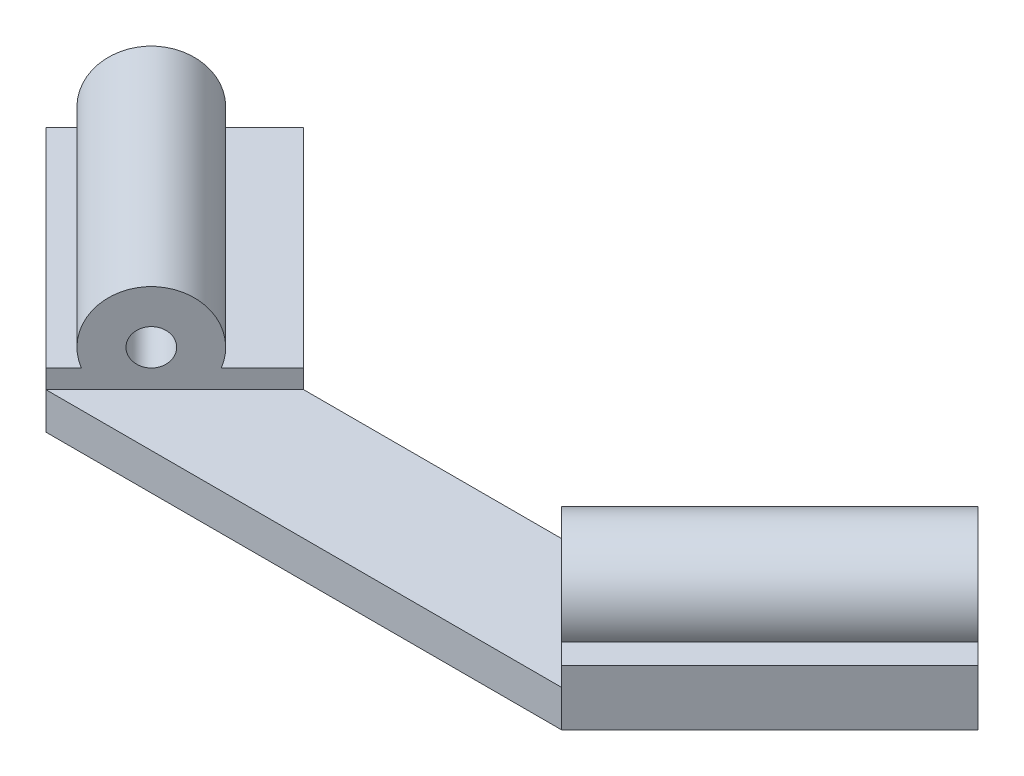
ISO-10303-21;
HEADER;
FILE_DESCRIPTION(('STEP AP214'),'2;1');
FILE_NAME('part.step','',(''),(''),'','','');
FILE_SCHEMA(('AUTOMOTIVE_DESIGN { 1 0 10303 214 1 1 1 1 }'));
ENDSEC;
DATA;
#1=APPLICATION_CONTEXT('core data for automotive mechanical design processes');
#2=APPLICATION_PROTOCOL_DEFINITION('international standard','automotive_design',2000,#1);
#3=PRODUCT_CONTEXT('',#1,'mechanical');
#4=PRODUCT('Part','Part','',(#3));
#5=PRODUCT_RELATED_PRODUCT_CATEGORY('part','',(#4));
#6=PRODUCT_DEFINITION_FORMATION('','',#4);
#7=PRODUCT_DEFINITION_CONTEXT('part definition',#1,'design');
#8=PRODUCT_DEFINITION('design','',#6,#7);
#9=PRODUCT_DEFINITION_SHAPE('','',#8);
#10=(LENGTH_UNIT() NAMED_UNIT(*) SI_UNIT(.MILLI.,.METRE.));
#11=(NAMED_UNIT(*) PLANE_ANGLE_UNIT() SI_UNIT($,.RADIAN.));
#12=(NAMED_UNIT(*) SI_UNIT($,.STERADIAN.) SOLID_ANGLE_UNIT());
#13=UNCERTAINTY_MEASURE_WITH_UNIT(LENGTH_MEASURE(1.E-05),#10,'distance_accuracy_value','');
#14=(GEOMETRIC_REPRESENTATION_CONTEXT(3) GLOBAL_UNCERTAINTY_ASSIGNED_CONTEXT((#13)) GLOBAL_UNIT_ASSIGNED_CONTEXT((#10,
#11,#12)) REPRESENTATION_CONTEXT('',''));
#15=CARTESIAN_POINT('',(0.,0.,0.));
#16=DIRECTION('',(0.,0.,1.));
#17=DIRECTION('',(1.,0.,0.));
#18=AXIS2_PLACEMENT_3D('',#15,#16,#17);
#19=CARTESIAN_POINT('',(-96.8356396317676,9.,19.6760971124126));
#20=DIRECTION('',(0.,0.,1.));
#21=DIRECTION('',(1.,0.,0.));
#22=AXIS2_PLACEMENT_3D('',#19,#20,#21);
#23=PLANE('',#22);
#24=DIRECTION('',(-1.,0.,0.));
#25=VECTOR('',#24,1.);
#26=CARTESIAN_POINT('',(-96.8356396317676,4.,19.6760971124126));
#27=LINE('',#26,#25);
#28=CARTESIAN_POINT('',(-61.8356396317676,4.,19.6760971124126));
#29=VERTEX_POINT('',#28);
#30=CARTESIAN_POINT('',(-96.8356396317677,4.,19.6760971124125));
#31=VERTEX_POINT('',#30);
#32=EDGE_CURVE('E279',#29,#31,#27,.T.);
#33=ORIENTED_EDGE('',*,*,#32,.T.);
#34=DIRECTION('',(0.,-1.,0.));
#35=VECTOR('',#34,1.);
#36=CARTESIAN_POINT('',(-96.8356396317676,9.,19.6760971124126));
#37=LINE('',#36,#35);
#38=CARTESIAN_POINT('',(-96.8356396317677,9.,19.6760971124125));
#39=VERTEX_POINT('',#38);
#40=EDGE_CURVE('E49',#39,#31,#37,.T.);
#41=ORIENTED_EDGE('',*,*,#40,.F.);
#42=DIRECTION('',(-1.,0.,0.));
#43=VECTOR('',#42,1.);
#44=CARTESIAN_POINT('',(-96.8356396317676,9.,19.6760971124126));
#45=LINE('',#44,#43);
#46=CARTESIAN_POINT('',(-61.8356396317676,9.,19.6760971124126));
#47=VERTEX_POINT('',#46);
#48=EDGE_CURVE('E284',#47,#39,#45,.T.);
#49=ORIENTED_EDGE('',*,*,#48,.F.);
#50=DIRECTION('',(0.,-1.,0.));
#51=VECTOR('',#50,1.);
#52=CARTESIAN_POINT('',(-61.8356396317676,9.,19.6760971124126));
#53=LINE('',#52,#51);
#54=EDGE_CURVE('E11',#47,#29,#53,.T.);
#55=ORIENTED_EDGE('',*,*,#54,.T.);
#56=EDGE_LOOP('',(#33,#41,#49,#55));
#57=FACE_BOUND('',#56,.T.);
#58=ADVANCED_FACE('F41',(#57),#23,.F.);
#59=CARTESIAN_POINT('',(-114.335639631768,9.,37.1760971124125));
#60=DIRECTION('',(0.,0.,-1.));
#61=DIRECTION('',(-1.,0.,0.));
#62=AXIS2_PLACEMENT_3D('',#59,#60,#61);
#63=PLANE('',#62);
#64=DIRECTION('',(1.,0.,0.));
#65=VECTOR('',#64,1.);
#66=CARTESIAN_POINT('',(-114.335639631768,4.,37.1760971124125));
#67=LINE('',#66,#65);
#68=CARTESIAN_POINT('',(-114.335639631768,4.,37.1760971124125));
#69=VERTEX_POINT('',#68);
#70=CARTESIAN_POINT('',(-44.3356396317675,4.,37.1760971124125));
#71=VERTEX_POINT('',#70);
#72=EDGE_CURVE('E285',#69,#71,#67,.T.);
#73=ORIENTED_EDGE('',*,*,#72,.T.);
#74=DIRECTION('',(0.,-1.,0.));
#75=VECTOR('',#74,1.);
#76=CARTESIAN_POINT('',(-44.3356396317675,9.,37.1760971124125));
#77=LINE('',#76,#75);
#78=CARTESIAN_POINT('',(-44.3356396317675,9.,37.1760971124125));
#79=VERTEX_POINT('',#78);
#80=EDGE_CURVE('E297',#79,#71,#77,.T.);
#81=ORIENTED_EDGE('',*,*,#80,.F.);
#82=DIRECTION('',(1.,0.,0.));
#83=VECTOR('',#82,1.);
#84=CARTESIAN_POINT('',(-114.335639631768,9.,37.1760971124125));
#85=LINE('',#84,#83);
#86=CARTESIAN_POINT('',(-114.335639631768,9.,37.1760971124125));
#87=VERTEX_POINT('',#86);
#88=EDGE_CURVE('E293',#87,#79,#85,.T.);
#89=ORIENTED_EDGE('',*,*,#88,.F.);
#90=DIRECTION('',(0.,-1.,0.));
#91=VECTOR('',#90,1.);
#92=CARTESIAN_POINT('',(-114.335639631768,9.,37.1760971124125));
#93=LINE('',#92,#91);
#94=EDGE_CURVE('E56',#87,#69,#93,.T.);
#95=ORIENTED_EDGE('',*,*,#94,.T.);
#96=EDGE_LOOP('',(#73,#81,#89,#95));
#97=FACE_BOUND('',#96,.T.);
#98=ADVANCED_FACE('F339',(#97),#63,.F.);
#99=CARTESIAN_POINT('',(0.,9.,0.));
#100=DIRECTION('',(0.,-1.,0.));
#101=DIRECTION('',(0.,0.,-1.));
#102=AXIS2_PLACEMENT_3D('',#99,#100,#101);
#103=PLANE('',#102);
#104=DIRECTION('',(-0.707106781186551,0.,-0.707106781186544));
#105=VECTOR('',#104,1.);
#106=CARTESIAN_POINT('',(-44.3356396317675,9.,37.1760971124125));
#107=LINE('',#106,#105);
#108=EDGE_CURVE('E280',#79,#47,#107,.T.);
#109=ORIENTED_EDGE('',*,*,#108,.T.);
#110=ORIENTED_EDGE('',*,*,#48,.T.);
#111=DIRECTION('',(-0.707106781186546,0.,0.707106781186549));
#112=VECTOR('',#111,1.);
#113=CARTESIAN_POINT('',(-114.335639631768,9.,37.1760971124125));
#114=LINE('',#113,#112);
#115=EDGE_CURVE('E289',#39,#87,#114,.T.);
#116=ORIENTED_EDGE('',*,*,#115,.T.);
#117=ORIENTED_EDGE('',*,*,#88,.T.);
#118=EDGE_LOOP('',(#109,#110,#116,#117));
#119=FACE_BOUND('',#118,.T.);
#120=ADVANCED_FACE('F321',(#119),#103,.F.);
#121=CARTESIAN_POINT('',(0.,4.,0.));
#122=DIRECTION('',(0.,-1.,0.));
#123=DIRECTION('',(0.,0.,-1.));
#124=AXIS2_PLACEMENT_3D('',#121,#122,#123);
#125=PLANE('',#124);
#126=ORIENTED_EDGE('',*,*,#32,.F.);
#127=DIRECTION('',(-0.707106781186544,0.,0.707106781186551));
#128=VECTOR('',#127,1.);
#129=CARTESIAN_POINT('',(-33.5513683843059,4.,-8.60817413504949));
#130=LINE('',#129,#128);
#131=CARTESIAN_POINT('',(-33.5513683843059,4.,-8.60817413504949));
#132=VERTEX_POINT('',#131);
#133=EDGE_CURVE('E273',#132,#29,#130,.T.);
#134=ORIENTED_EDGE('',*,*,#133,.F.);
#135=DIRECTION('',(-0.707106781186551,0.,-0.707106781186544));
#136=VECTOR('',#135,1.);
#137=CARTESIAN_POINT('',(-12.471597124628,4.,12.4715971246282));
#138=LINE('',#137,#136);
#139=CARTESIAN_POINT('',(-16.0513683843058,4.,8.89182586495045));
#140=VERTEX_POINT('',#139);
#141=EDGE_CURVE('E227',#140,#132,#138,.T.);
#142=ORIENTED_EDGE('',*,*,#141,.F.);
#143=DIRECTION('',(-0.707106781186544,0.,0.707106781186551));
#144=VECTOR('',#143,1.);
#145=CARTESIAN_POINT('',(-16.0513683843058,4.,8.89182586495045));
#146=LINE('',#145,#144);
#147=EDGE_CURVE('E276',#140,#71,#146,.T.);
#148=ORIENTED_EDGE('',*,*,#147,.T.);
#149=ORIENTED_EDGE('',*,*,#72,.F.);
#150=DIRECTION('',(0.707106781186549,0.,0.707106781186546));
#151=VECTOR('',#150,1.);
#152=CARTESIAN_POINT('',(-142.61991087923,4.,8.89182586495062));
#153=LINE('',#152,#151);
#154=CARTESIAN_POINT('',(-142.61991087923,4.,8.89182586495062));
#155=VERTEX_POINT('',#154);
#156=EDGE_CURVE('E154',#155,#69,#153,.T.);
#157=ORIENTED_EDGE('',*,*,#156,.F.);
#158=DIRECTION('',(-0.707106781186546,0.,0.707106781186549));
#159=VECTOR('',#158,1.);
#160=CARTESIAN_POINT('',(-66.8640425071397,4.,-66.8640425071395));
#161=LINE('',#160,#159);
#162=CARTESIAN_POINT('',(-125.11991087923,4.,-8.60817413504933));
#163=VERTEX_POINT('',#162);
#164=EDGE_CURVE('E158',#163,#155,#161,.T.);
#165=ORIENTED_EDGE('',*,*,#164,.F.);
#166=DIRECTION('',(0.707106781186549,0.,0.707106781186546));
#167=VECTOR('',#166,1.);
#168=CARTESIAN_POINT('',(-125.11991087923,4.,-8.60817413504933));
#169=LINE('',#168,#167);
#170=EDGE_CURVE('E140',#163,#31,#169,.T.);
#171=ORIENTED_EDGE('',*,*,#170,.T.);
#172=EDGE_LOOP('',(#126,#134,#142,#148,#149,#157,#165,#171));
#173=FACE_BOUND('',#172,.T.);
#174=ADVANCED_FACE('F159',(#173),#125,.T.);
#175=CARTESIAN_POINT('',(-16.0513683843058,0.,8.89182586495046));
#176=DIRECTION('',(0.707106781186551,0.,0.707106781186544));
#177=DIRECTION('',(0.707106781186544,0.,-0.707106781186551));
#178=AXIS2_PLACEMENT_3D('',#175,#176,#177);
#179=PLANE('',#178);
#180=ORIENTED_EDGE('',*,*,#80,.T.);
#181=ORIENTED_EDGE('',*,*,#147,.F.);
#182=DIRECTION('',(0.,1.,0.));
#183=VECTOR('',#182,1.);
#184=CARTESIAN_POINT('',(-16.0513683843058,0.,8.89182586495046));
#185=LINE('',#184,#183);
#186=CARTESIAN_POINT('',(-16.0513683843058,11.55,8.89182586495046));
#187=VERTEX_POINT('',#186);
#188=EDGE_CURVE('E222',#140,#187,#185,.T.);
#189=ORIENTED_EDGE('',*,*,#188,.T.);
#190=DIRECTION('',(-0.707106781186544,0.,0.707106781186551));
#191=VECTOR('',#190,1.);
#192=CARTESIAN_POINT('',(-16.0513683843058,11.55,8.89182586495046));
#193=LINE('',#192,#191);
#194=CARTESIAN_POINT('',(-44.3356396317675,11.55,37.1760971124125));
#195=VERTEX_POINT('',#194);
#196=EDGE_CURVE('E259',#187,#195,#193,.T.);
#197=ORIENTED_EDGE('',*,*,#196,.T.);
#198=DIRECTION('',(0.,1.,0.));
#199=VECTOR('',#198,1.);
#200=CARTESIAN_POINT('',(-44.3356396317675,0.,37.1760971124125));
#201=LINE('',#200,#199);
#202=EDGE_CURVE('E245',#79,#195,#201,.T.);
#203=ORIENTED_EDGE('',*,*,#202,.F.);
#204=EDGE_LOOP('',(#180,#181,#189,#197,#203));
#205=FACE_BOUND('',#204,.T.);
#206=ADVANCED_FACE('F334',(#205),#179,.T.);
#207=CARTESIAN_POINT('',(-33.5513683843059,0.,-8.60817413504948));
#208=DIRECTION('',(0.707106781186551,0.,0.707106781186544));
#209=DIRECTION('',(0.707106781186544,0.,-0.707106781186551));
#210=AXIS2_PLACEMENT_3D('',#207,#208,#209);
#211=PLANE('',#210);
#212=ORIENTED_EDGE('',*,*,#54,.F.);
#213=DIRECTION('',(0.,1.,0.));
#214=VECTOR('',#213,1.);
#215=CARTESIAN_POINT('',(-61.8356396317676,0.,19.6760971124126));
#216=LINE('',#215,#214);
#217=CARTESIAN_POINT('',(-61.8356396317676,11.55,19.6760971124126));
#218=VERTEX_POINT('',#217);
#219=EDGE_CURVE('E248',#47,#218,#216,.T.);
#220=ORIENTED_EDGE('',*,*,#219,.T.);
#221=DIRECTION('',(-0.707106781186544,0.,0.707106781186551));
#222=VECTOR('',#221,1.);
#223=CARTESIAN_POINT('',(-33.5513683843059,11.55,-8.60817413504949));
#224=LINE('',#223,#222);
#225=CARTESIAN_POINT('',(-33.5513683843059,11.55,-8.60817413504949));
#226=VERTEX_POINT('',#225);
#227=EDGE_CURVE('E269',#226,#218,#224,.T.);
#228=ORIENTED_EDGE('',*,*,#227,.F.);
#229=DIRECTION('',(0.,1.,0.));
#230=VECTOR('',#229,1.);
#231=CARTESIAN_POINT('',(-33.5513683843059,0.,-8.60817413504948));
#232=LINE('',#231,#230);
#233=EDGE_CURVE('E231',#132,#226,#232,.T.);
#234=ORIENTED_EDGE('',*,*,#233,.F.);
#235=ORIENTED_EDGE('',*,*,#133,.T.);
#236=EDGE_LOOP('',(#212,#220,#228,#234,#235));
#237=FACE_BOUND('',#236,.T.);
#238=ADVANCED_FACE('F327',(#237),#211,.F.);
#239=CARTESIAN_POINT('',(-12.471597124628,11.55,12.4715971246282));
#240=DIRECTION('',(0.,1.,0.));
#241=DIRECTION('',(0.,0.,1.));
#242=AXIS2_PLACEMENT_3D('',#239,#240,#241);
#243=PLANE('',#242);
#244=DIRECTION('',(-0.707106781186551,0.,-0.707106781186544));
#245=VECTOR('',#244,1.);
#246=CARTESIAN_POINT('',(-40.7558683720898,11.55,40.7558683720902));
#247=LINE('',#246,#245);
#248=CARTESIAN_POINT('',(-56.6114132583052,11.55,24.9003234858749));
#249=VERTEX_POINT('',#248);
#250=EDGE_CURVE('E251',#249,#218,#247,.T.);
#251=ORIENTED_EDGE('',*,*,#250,.F.);
#252=DIRECTION('',(-0.707106781186544,0.,0.707106781186551));
#253=VECTOR('',#252,1.);
#254=CARTESIAN_POINT('',(-28.3271420108435,11.55,-3.38394776158714));
#255=LINE('',#254,#253);
#256=CARTESIAN_POINT('',(-28.3271420108435,11.55,-3.38394776158714));
#257=VERTEX_POINT('',#256);
#258=EDGE_CURVE('E266',#257,#249,#255,.T.);
#259=ORIENTED_EDGE('',*,*,#258,.F.);
#260=DIRECTION('',(-0.707106781186551,0.,-0.707106781186544));
#261=VECTOR('',#260,1.);
#262=CARTESIAN_POINT('',(-12.471597124628,11.55,12.4715971246282));
#263=LINE('',#262,#261);
#264=EDGE_CURVE('E234',#257,#226,#263,.T.);
#265=ORIENTED_EDGE('',*,*,#264,.T.);
#266=ORIENTED_EDGE('',*,*,#227,.T.);
#267=EDGE_LOOP('',(#251,#259,#265,#266));
#268=FACE_BOUND('',#267,.T.);
#269=ADVANCED_FACE('F359',(#268),#243,.T.);
#270=CARTESIAN_POINT('',(-23.5785711732125,13.9862500000003,1.36462307604383));
#271=DIRECTION('',(-0.707106781186544,0.,0.707106781186551));
#272=DIRECTION('',(0.707106781186551,0.,0.707106781186544));
#273=AXIS2_PLACEMENT_3D('',#270,#271,#272);
#274=CYLINDRICAL_SURFACE('',#273,7.14375);
#275=CARTESIAN_POINT('',(-51.8628424206742,13.9862500000003,29.6488943235059));
#276=DIRECTION('',(0.707106781186544,0.,-0.707106781186551));
#277=DIRECTION('',(-0.707106781186551,0.,-0.707106781186544));
#278=AXIS2_PLACEMENT_3D('',#275,#276,#277);
#279=CIRCLE('',#278,7.14375);
#280=CARTESIAN_POINT('',(-47.1142715830432,11.55,34.3974651611368));
#281=VERTEX_POINT('',#280);
#282=EDGE_CURVE('E255',#249,#281,#279,.T.);
#283=ORIENTED_EDGE('',*,*,#282,.T.);
#284=DIRECTION('',(-0.707106781186544,0.,0.707106781186551));
#285=VECTOR('',#284,1.);
#286=CARTESIAN_POINT('',(-18.8300003355815,11.55,6.11319391367479));
#287=LINE('',#286,#285);
#288=CARTESIAN_POINT('',(-18.8300003355815,11.55,6.11319391367479));
#289=VERTEX_POINT('',#288);
#290=EDGE_CURVE('E263',#289,#281,#287,.T.);
#291=ORIENTED_EDGE('',*,*,#290,.F.);
#292=CARTESIAN_POINT('',(-23.5785711732125,13.9862500000003,1.36462307604383));
#293=DIRECTION('',(0.707106781186544,0.,-0.707106781186551));
#294=DIRECTION('',(-0.707106781186551,0.,-0.707106781186544));
#295=AXIS2_PLACEMENT_3D('',#292,#293,#294);
#296=CIRCLE('',#295,7.14375);
#297=EDGE_CURVE('E238',#257,#289,#296,.T.);
#298=ORIENTED_EDGE('',*,*,#297,.F.);
#299=ORIENTED_EDGE('',*,*,#258,.T.);
#300=EDGE_LOOP('',(#283,#291,#298,#299));
#301=FACE_BOUND('',#300,.T.);
#302=ADVANCED_FACE('F353',(#301),#274,.T.);
#303=CARTESIAN_POINT('',(-23.5785711732125,13.9862500000003,1.36462307604383));
#304=DIRECTION('',(-0.707106781186544,0.,0.707106781186551));
#305=DIRECTION('',(0.707106781186551,0.,0.707106781186544));
#306=AXIS2_PLACEMENT_3D('',#303,#304,#305);
#307=CYLINDRICAL_SURFACE('',#306,2.43625000000026);
#308=CARTESIAN_POINT('',(-23.5785711732125,13.9862500000003,1.36462307604383));
#309=DIRECTION('',(0.707106781186544,0.,-0.707106781186551));
#310=DIRECTION('',(-0.707106781186551,0.,-0.707106781186544));
#311=AXIS2_PLACEMENT_3D('',#308,#309,#310);
#312=CIRCLE('',#311,2.43625000000026);
#313=CARTESIAN_POINT('',(-25.3012600688784,13.9862500000003,-0.358065819622068));
#314=VERTEX_POINT('',#313);
#315=EDGE_CURVE('E218',#314,#314,#312,.T.);
#316=ORIENTED_EDGE('',*,*,#315,.T.);
#317=EDGE_LOOP('',(#316));
#318=FACE_BOUND('',#317,.T.);
#319=CARTESIAN_POINT('',(-51.8628424206742,13.9862500000003,29.6488943235059));
#320=DIRECTION('',(0.707106781186544,0.,-0.707106781186551));
#321=DIRECTION('',(-0.707106781186551,0.,-0.707106781186544));
#322=AXIS2_PLACEMENT_3D('',#319,#320,#321);
#323=CIRCLE('',#322,2.43625000000026);
#324=CARTESIAN_POINT('',(-53.5855313163401,13.9862500000003,27.92620542784));
#325=VERTEX_POINT('',#324);
#326=EDGE_CURVE('E153',#325,#325,#323,.T.);
#327=ORIENTED_EDGE('',*,*,#326,.F.);
#328=EDGE_LOOP('',(#327));
#329=FACE_BOUND('',#328,.T.);
#330=ADVANCED_FACE('F349',(#318,#329),#307,.F.);
#331=EDGE_CURVE('E223',#195,#281,#247,.T.);
#332=ORIENTED_EDGE('',*,*,#331,.F.);
#333=ORIENTED_EDGE('',*,*,#196,.F.);
#334=EDGE_CURVE('E239',#187,#289,#263,.T.);
#335=ORIENTED_EDGE('',*,*,#334,.T.);
#336=ORIENTED_EDGE('',*,*,#290,.T.);
#337=EDGE_LOOP('',(#332,#333,#335,#336));
#338=FACE_BOUND('',#337,.T.);
#339=ADVANCED_FACE('F352',(#338),#243,.T.);
#340=CARTESIAN_POINT('',(-12.471597124628,0.,12.4715971246282));
#341=DIRECTION('',(0.707106781186544,0.,-0.707106781186551));
#342=DIRECTION('',(-0.707106781186551,0.,-0.707106781186544));
#343=AXIS2_PLACEMENT_3D('',#340,#341,#342);
#344=PLANE('',#343);
#345=ORIENTED_EDGE('',*,*,#315,.F.);
#346=EDGE_LOOP('',(#345));
#347=FACE_BOUND('',#346,.T.);
#348=ORIENTED_EDGE('',*,*,#188,.F.);
#349=ORIENTED_EDGE('',*,*,#141,.T.);
#350=ORIENTED_EDGE('',*,*,#233,.T.);
#351=ORIENTED_EDGE('',*,*,#264,.F.);
#352=ORIENTED_EDGE('',*,*,#297,.T.);
#353=ORIENTED_EDGE('',*,*,#334,.F.);
#354=EDGE_LOOP('',(#348,#349,#350,#351,#352,#353));
#355=FACE_BOUND('',#354,.T.);
#356=ADVANCED_FACE('F331',(#347,#355),#344,.T.);
#357=CARTESIAN_POINT('',(-40.7558683720898,0.,40.7558683720902));
#358=DIRECTION('',(0.707106781186544,0.,-0.707106781186551));
#359=DIRECTION('',(-0.707106781186551,0.,-0.707106781186544));
#360=AXIS2_PLACEMENT_3D('',#357,#358,#359);
#361=PLANE('',#360);
#362=ORIENTED_EDGE('',*,*,#108,.F.);
#363=ORIENTED_EDGE('',*,*,#202,.T.);
#364=ORIENTED_EDGE('',*,*,#331,.T.);
#365=ORIENTED_EDGE('',*,*,#282,.F.);
#366=ORIENTED_EDGE('',*,*,#250,.T.);
#367=ORIENTED_EDGE('',*,*,#219,.F.);
#368=EDGE_LOOP('',(#362,#363,#364,#365,#366,#367));
#369=FACE_BOUND('',#368,.T.);
#370=ORIENTED_EDGE('',*,*,#326,.T.);
#371=EDGE_LOOP('',(#370));
#372=FACE_BOUND('',#371,.T.);
#373=ADVANCED_FACE('F366',(#369,#372),#361,.F.);
#374=CARTESIAN_POINT('',(-125.11991087923,0.,-8.60817413504934));
#375=DIRECTION('',(0.707106781186546,0.,-0.707106781186549));
#376=DIRECTION('',(-0.707106781186549,0.,-0.707106781186546));
#377=AXIS2_PLACEMENT_3D('',#374,#375,#376);
#378=PLANE('',#377);
#379=ORIENTED_EDGE('',*,*,#40,.T.);
#380=ORIENTED_EDGE('',*,*,#170,.F.);
#381=DIRECTION('',(0.,1.,0.));
#382=VECTOR('',#381,1.);
#383=CARTESIAN_POINT('',(-125.11991087923,0.,-8.60817413504934));
#384=LINE('',#383,#382);
#385=CARTESIAN_POINT('',(-125.11991087923,11.55,-8.60817413504934));
#386=VERTEX_POINT('',#385);
#387=EDGE_CURVE('E145',#163,#386,#384,.T.);
#388=ORIENTED_EDGE('',*,*,#387,.T.);
#389=DIRECTION('',(0.707106781186549,0.,0.707106781186546));
#390=VECTOR('',#389,1.);
#391=CARTESIAN_POINT('',(-125.11991087923,11.55,-8.60817413504934));
#392=LINE('',#391,#390);
#393=CARTESIAN_POINT('',(-96.8356396317677,11.55,19.6760971124125));
#394=VERTEX_POINT('',#393);
#395=EDGE_CURVE('E203',#386,#394,#392,.T.);
#396=ORIENTED_EDGE('',*,*,#395,.T.);
#397=DIRECTION('',(0.,1.,0.));
#398=VECTOR('',#397,1.);
#399=CARTESIAN_POINT('',(-96.8356396317677,0.,19.6760971124125));
#400=LINE('',#399,#398);
#401=EDGE_CURVE('E189',#39,#394,#400,.T.);
#402=ORIENTED_EDGE('',*,*,#401,.F.);
#403=EDGE_LOOP('',(#379,#380,#388,#396,#402));
#404=FACE_BOUND('',#403,.T.);
#405=ADVANCED_FACE('F142',(#404),#378,.T.);
#406=CARTESIAN_POINT('',(-142.61991087923,0.,8.8918258649506));
#407=DIRECTION('',(0.707106781186546,0.,-0.707106781186549));
#408=DIRECTION('',(-0.707106781186549,0.,-0.707106781186546));
#409=AXIS2_PLACEMENT_3D('',#406,#407,#408);
#410=PLANE('',#409);
#411=ORIENTED_EDGE('',*,*,#94,.F.);
#412=DIRECTION('',(0.,1.,0.));
#413=VECTOR('',#412,1.);
#414=CARTESIAN_POINT('',(-114.335639631768,0.,37.1760971124124));
#415=LINE('',#414,#413);
#416=CARTESIAN_POINT('',(-114.335639631768,11.55,37.1760971124124));
#417=VERTEX_POINT('',#416);
#418=EDGE_CURVE('E192',#87,#417,#415,.T.);
#419=ORIENTED_EDGE('',*,*,#418,.T.);
#420=DIRECTION('',(0.707106781186549,0.,0.707106781186546));
#421=VECTOR('',#420,1.);
#422=CARTESIAN_POINT('',(-142.61991087923,11.55,8.8918258649506));
#423=LINE('',#422,#421);
#424=CARTESIAN_POINT('',(-142.61991087923,11.55,8.8918258649506));
#425=VERTEX_POINT('',#424);
#426=EDGE_CURVE('E212',#425,#417,#423,.T.);
#427=ORIENTED_EDGE('',*,*,#426,.F.);
#428=DIRECTION('',(0.,1.,0.));
#429=VECTOR('',#428,1.);
#430=CARTESIAN_POINT('',(-142.61991087923,0.,8.8918258649506));
#431=LINE('',#430,#429);
#432=EDGE_CURVE('E163',#155,#425,#431,.T.);
#433=ORIENTED_EDGE('',*,*,#432,.F.);
#434=ORIENTED_EDGE('',*,*,#156,.T.);
#435=EDGE_LOOP('',(#411,#419,#427,#433,#434));
#436=FACE_BOUND('',#435,.T.);
#437=ADVANCED_FACE('F380',(#436),#410,.F.);
#438=CARTESIAN_POINT('',(-66.8640425071397,11.55,-66.8640425071395));
#439=DIRECTION('',(0.,1.,0.));
#440=DIRECTION('',(0.,0.,1.));
#441=AXIS2_PLACEMENT_3D('',#438,#439,#440);
#442=PLANE('',#441);
#443=DIRECTION('',(-0.707106781186546,0.,0.707106781186549));
#444=VECTOR('',#443,1.);
#445=CARTESIAN_POINT('',(-38.5797712596777,11.55,-38.5797712596776));
#446=LINE('',#445,#444);
#447=CARTESIAN_POINT('',(-111.932846059655,11.55,34.7733035402998));
#448=VERTEX_POINT('',#447);
#449=EDGE_CURVE('E195',#448,#417,#446,.T.);
#450=ORIENTED_EDGE('',*,*,#449,.F.);
#451=DIRECTION('',(0.707106781186549,0.,0.707106781186546));
#452=VECTOR('',#451,1.);
#453=CARTESIAN_POINT('',(-140.217117307117,11.55,6.48903229283798));
#454=LINE('',#453,#452);
#455=CARTESIAN_POINT('',(-140.217117307117,11.55,6.48903229283798));
#456=VERTEX_POINT('',#455);
#457=EDGE_CURVE('E209',#456,#448,#454,.T.);
#458=ORIENTED_EDGE('',*,*,#457,.F.);
#459=DIRECTION('',(-0.707106781186546,0.,0.707106781186549));
#460=VECTOR('',#459,1.);
#461=CARTESIAN_POINT('',(-66.8640425071397,11.55,-66.8640425071395));
#462=LINE('',#461,#460);
#463=EDGE_CURVE('E178',#456,#425,#462,.T.);
#464=ORIENTED_EDGE('',*,*,#463,.T.);
#465=ORIENTED_EDGE('',*,*,#426,.T.);
#466=EDGE_LOOP('',(#450,#458,#464,#465));
#467=FACE_BOUND('',#466,.T.);
#468=ADVANCED_FACE('F383',(#467),#442,.T.);
#469=CARTESIAN_POINT('',(-135.468546469486,13.9862499999998,1.74046145520686));
#470=DIRECTION('',(0.707106781186549,0.,0.707106781186546));
#471=DIRECTION('',(0.707106781186546,0.,-0.707106781186549));
#472=AXIS2_PLACEMENT_3D('',#469,#470,#471);
#473=CYLINDRICAL_SURFACE('',#472,7.14375);
#474=CARTESIAN_POINT('',(-107.184275222024,13.9862499999998,30.0247327026687));
#475=DIRECTION('',(-0.707106781186549,0.,-0.707106781186546));
#476=DIRECTION('',(-0.707106781186546,0.,0.707106781186549));
#477=AXIS2_PLACEMENT_3D('',#474,#475,#476);
#478=CIRCLE('',#477,7.14375);
#479=CARTESIAN_POINT('',(-102.435704384393,11.55,25.2761618650376));
#480=VERTEX_POINT('',#479);
#481=EDGE_CURVE('E199',#448,#480,#478,.T.);
#482=ORIENTED_EDGE('',*,*,#481,.T.);
#483=DIRECTION('',(0.707106781186549,0.,0.707106781186546));
#484=VECTOR('',#483,1.);
#485=CARTESIAN_POINT('',(-130.719975631855,11.55,-3.00810938242423));
#486=LINE('',#485,#484);
#487=CARTESIAN_POINT('',(-130.719975631855,11.55,-3.00810938242423));
#488=VERTEX_POINT('',#487);
#489=EDGE_CURVE('E206',#488,#480,#486,.T.);
#490=ORIENTED_EDGE('',*,*,#489,.F.);
#491=CARTESIAN_POINT('',(-135.468546469486,13.9862499999998,1.74046145520686));
#492=DIRECTION('',(-0.707106781186549,0.,-0.707106781186546));
#493=DIRECTION('',(-0.707106781186546,0.,0.707106781186549));
#494=AXIS2_PLACEMENT_3D('',#491,#492,#493);
#495=CIRCLE('',#494,7.14375);
#496=EDGE_CURVE('E182',#456,#488,#495,.T.);
#497=ORIENTED_EDGE('',*,*,#496,.F.);
#498=ORIENTED_EDGE('',*,*,#457,.T.);
#499=EDGE_LOOP('',(#482,#490,#497,#498));
#500=FACE_BOUND('',#499,.T.);
#501=ADVANCED_FACE('F376',(#500),#473,.T.);
#502=CARTESIAN_POINT('',(-135.468546469486,13.9862499999998,1.74046145520686));
#503=DIRECTION('',(0.707106781186549,0.,0.707106781186546));
#504=DIRECTION('',(0.707106781186546,0.,-0.707106781186549));
#505=AXIS2_PLACEMENT_3D('',#502,#503,#504);
#506=CYLINDRICAL_SURFACE('',#505,2.43624999999982);
#507=CARTESIAN_POINT('',(-135.468546469486,13.9862499999998,1.74046145520686));
#508=DIRECTION('',(-0.707106781186549,0.,-0.707106781186546));
#509=DIRECTION('',(-0.707106781186546,0.,0.707106781186549));
#510=AXIS2_PLACEMENT_3D('',#507,#508,#509);
#511=CIRCLE('',#510,2.43624999999982);
#512=CARTESIAN_POINT('',(-137.191235365151,13.9862499999998,3.46315035087246));
#513=VERTEX_POINT('',#512);
#514=EDGE_CURVE('E169',#513,#513,#511,.T.);
#515=ORIENTED_EDGE('',*,*,#514,.T.);
#516=EDGE_LOOP('',(#515));
#517=FACE_BOUND('',#516,.T.);
#518=CARTESIAN_POINT('',(-107.184275222024,13.9862499999998,30.0247327026687));
#519=DIRECTION('',(-0.707106781186549,0.,-0.707106781186546));
#520=DIRECTION('',(-0.707106781186546,0.,0.707106781186549));
#521=AXIS2_PLACEMENT_3D('',#518,#519,#520);
#522=CIRCLE('',#521,2.43624999999982);
#523=CARTESIAN_POINT('',(-108.906964117689,13.9862499999998,31.7474215983343));
#524=VERTEX_POINT('',#523);
#525=EDGE_CURVE('E185',#524,#524,#522,.T.);
#526=ORIENTED_EDGE('',*,*,#525,.F.);
#527=EDGE_LOOP('',(#526));
#528=FACE_BOUND('',#527,.T.);
#529=ADVANCED_FACE('F373',(#517,#528),#506,.F.);
#530=EDGE_CURVE('E173',#394,#480,#446,.T.);
#531=ORIENTED_EDGE('',*,*,#530,.F.);
#532=ORIENTED_EDGE('',*,*,#395,.F.);
#533=EDGE_CURVE('E167',#386,#488,#462,.T.);
#534=ORIENTED_EDGE('',*,*,#533,.T.);
#535=ORIENTED_EDGE('',*,*,#489,.T.);
#536=EDGE_LOOP('',(#531,#532,#534,#535));
#537=FACE_BOUND('',#536,.T.);
#538=ADVANCED_FACE('F315',(#537),#442,.T.);
#539=CARTESIAN_POINT('',(-66.8640425071397,0.,-66.8640425071395));
#540=DIRECTION('',(-0.707106781186549,0.,-0.707106781186546));
#541=DIRECTION('',(-0.707106781186546,0.,0.707106781186549));
#542=AXIS2_PLACEMENT_3D('',#539,#540,#541);
#543=PLANE('',#542);
#544=ORIENTED_EDGE('',*,*,#514,.F.);
#545=EDGE_LOOP('',(#544));
#546=FACE_BOUND('',#545,.T.);
#547=ORIENTED_EDGE('',*,*,#387,.F.);
#548=ORIENTED_EDGE('',*,*,#164,.T.);
#549=ORIENTED_EDGE('',*,*,#432,.T.);
#550=ORIENTED_EDGE('',*,*,#463,.F.);
#551=ORIENTED_EDGE('',*,*,#496,.T.);
#552=ORIENTED_EDGE('',*,*,#533,.F.);
#553=EDGE_LOOP('',(#547,#548,#549,#550,#551,#552));
#554=FACE_BOUND('',#553,.T.);
#555=ADVANCED_FACE('F165',(#546,#554),#543,.T.);
#556=CARTESIAN_POINT('',(-38.5797712596777,0.,-38.5797712596776));
#557=DIRECTION('',(-0.707106781186549,0.,-0.707106781186546));
#558=DIRECTION('',(-0.707106781186546,0.,0.707106781186549));
#559=AXIS2_PLACEMENT_3D('',#556,#557,#558);
#560=PLANE('',#559);
#561=ORIENTED_EDGE('',*,*,#115,.F.);
#562=ORIENTED_EDGE('',*,*,#401,.T.);
#563=ORIENTED_EDGE('',*,*,#530,.T.);
#564=ORIENTED_EDGE('',*,*,#481,.F.);
#565=ORIENTED_EDGE('',*,*,#449,.T.);
#566=ORIENTED_EDGE('',*,*,#418,.F.);
#567=EDGE_LOOP('',(#561,#562,#563,#564,#565,#566));
#568=FACE_BOUND('',#567,.T.);
#569=ORIENTED_EDGE('',*,*,#525,.T.);
#570=EDGE_LOOP('',(#569));
#571=FACE_BOUND('',#570,.T.);
#572=ADVANCED_FACE('F389',(#568,#571),#560,.F.);
#573=CLOSED_SHELL('',(#58,#98,#120,#174,#206,#238,#269,#302,#330,#339,#356,#373,#405,#437,#468,
#501,#529,#538,#555,#572));
#574=MANIFOLD_SOLID_BREP('B2',#573);
#575=ADVANCED_BREP_SHAPE_REPRESENTATION('',(#18,#574),#14);
#576=SHAPE_DEFINITION_REPRESENTATION(#9,#575);
ENDSEC;
END-ISO-10303-21;
